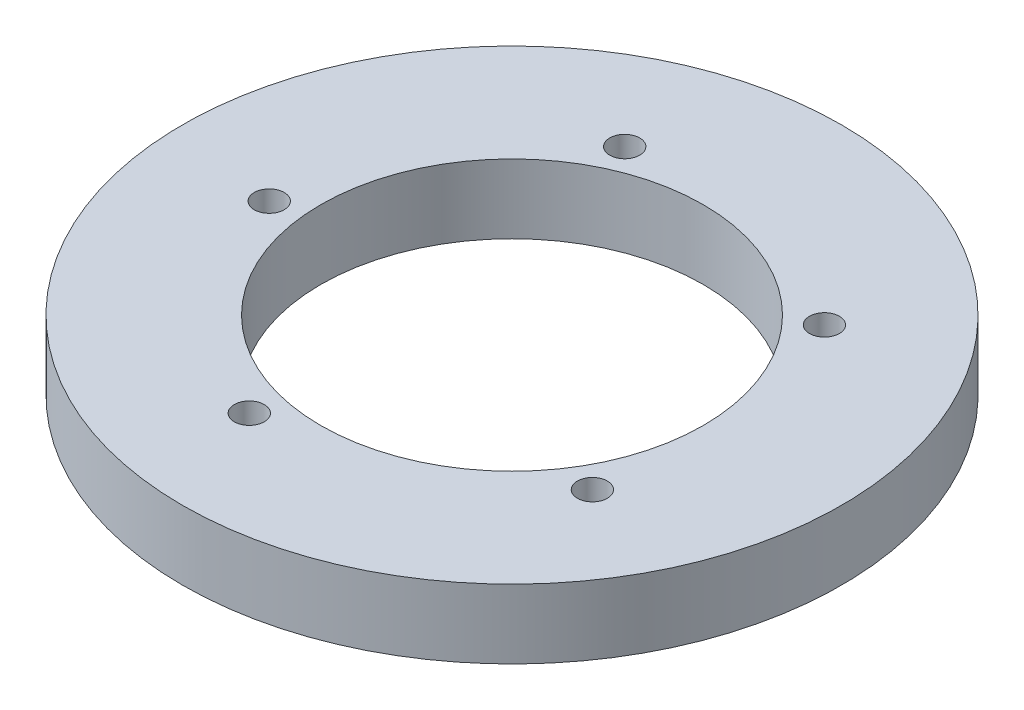
ISO-10303-21;
HEADER;
FILE_DESCRIPTION(('STEP AP214'),'2;1');
FILE_NAME('part.step','',(''),(''),'','','');
FILE_SCHEMA(('AUTOMOTIVE_DESIGN { 1 0 10303 214 1 1 1 1 }'));
ENDSEC;
DATA;
#1=APPLICATION_CONTEXT('core data for automotive mechanical design processes');
#2=APPLICATION_PROTOCOL_DEFINITION('international standard','automotive_design',2000,#1);
#3=PRODUCT_CONTEXT('',#1,'mechanical');
#4=PRODUCT('Part','Part','',(#3));
#5=PRODUCT_RELATED_PRODUCT_CATEGORY('part','',(#4));
#6=PRODUCT_DEFINITION_FORMATION('','',#4);
#7=PRODUCT_DEFINITION_CONTEXT('part definition',#1,'design');
#8=PRODUCT_DEFINITION('design','',#6,#7);
#9=PRODUCT_DEFINITION_SHAPE('','',#8);
#10=(LENGTH_UNIT() NAMED_UNIT(*) SI_UNIT(.MILLI.,.METRE.));
#11=(NAMED_UNIT(*) PLANE_ANGLE_UNIT() SI_UNIT($,.RADIAN.));
#12=(NAMED_UNIT(*) SI_UNIT($,.STERADIAN.) SOLID_ANGLE_UNIT());
#13=UNCERTAINTY_MEASURE_WITH_UNIT(LENGTH_MEASURE(1.E-05),#10,'distance_accuracy_value','');
#14=(GEOMETRIC_REPRESENTATION_CONTEXT(3) GLOBAL_UNCERTAINTY_ASSIGNED_CONTEXT((#13)) GLOBAL_UNIT_ASSIGNED_CONTEXT((#10,
#11,#12)) REPRESENTATION_CONTEXT('',''));
#15=CARTESIAN_POINT('',(0.,0.,0.));
#16=DIRECTION('',(0.,0.,1.));
#17=DIRECTION('',(1.,0.,0.));
#18=AXIS2_PLACEMENT_3D('',#15,#16,#17);
#19=CARTESIAN_POINT('',(-1.33623283332147,15.,-19.9052280990114));
#20=DIRECTION('',(0.,1.,0.));
#21=DIRECTION('',(0.,0.,1.));
#22=AXIS2_PLACEMENT_3D('',#19,#20,#21);
#23=PLANE('',#22);
#24=CARTESIAN_POINT('',(-49.0830279812245,15.,-14.9814538247186));
#25=DIRECTION('',(0.,1.,0.));
#26=DIRECTION('',(0.,0.,1.));
#27=AXIS2_PLACEMENT_3D('',#24,#25,#26);
#28=CIRCLE('',#27,3.25);
#29=CARTESIAN_POINT('',(-49.0830279812245,15.,-11.7314538247186));
#30=VERTEX_POINT('',#29);
#31=EDGE_CURVE('E84',#30,#30,#28,.T.);
#32=ORIENTED_EDGE('',*,*,#31,.F.);
#33=EDGE_LOOP('',(#32));
#34=FACE_BOUND('',#33,.T.);
#35=CARTESIAN_POINT('',(34.3976139642247,15.,-51.9535071955484));
#36=DIRECTION('',(0.,1.,0.));
#37=DIRECTION('',(0.,0.,1.));
#38=AXIS2_PLACEMENT_3D('',#35,#36,#37);
#39=CIRCLE('',#38,3.25);
#40=CARTESIAN_POINT('',(34.3976139642247,15.,-48.7035071955484));
#41=VERTEX_POINT('',#40);
#42=EDGE_CURVE('E68',#41,#41,#39,.T.);
#43=ORIENTED_EDGE('',*,*,#42,.F.);
#44=EDGE_LOOP('',(#43));
#45=FACE_BOUND('',#44,.T.);
#46=CARTESIAN_POINT('',(-1.33623283332147,15.,-19.9052280990114));
#47=DIRECTION('',(0.,1.,0.));
#48=DIRECTION('',(0.,0.,1.));
#49=AXIS2_PLACEMENT_3D('',#46,#47,#48);
#50=CIRCLE('',#49,41.5);
#51=CARTESIAN_POINT('',(-1.33623283332147,15.,21.5947719009886));
#52=VERTEX_POINT('',#51);
#53=EDGE_CURVE('E54',#52,#52,#50,.T.);
#54=ORIENTED_EDGE('',*,*,#53,.F.);
#55=EDGE_LOOP('',(#54));
#56=FACE_BOUND('',#55,.T.);
#57=CARTESIAN_POINT('',(-1.33623283332147,15.,-19.9052280990114));
#58=DIRECTION('',(0.,1.,0.));
#59=DIRECTION('',(0.,0.,1.));
#60=AXIS2_PLACEMENT_3D('',#57,#58,#59);
#61=CIRCLE('',#60,71.5);
#62=CARTESIAN_POINT('',(-1.33623283332147,15.,51.5947719009886));
#63=VERTEX_POINT('',#62);
#64=EDGE_CURVE('E10',#63,#63,#61,.T.);
#65=ORIENTED_EDGE('',*,*,#64,.T.);
#66=EDGE_LOOP('',(#65));
#67=FACE_BOUND('',#66,.T.);
#68=CARTESIAN_POINT('',(40.1858577723177,15.,4.17621686878607));
#69=DIRECTION('',(0.,1.,0.));
#70=DIRECTION('',(0.,0.,1.));
#71=AXIS2_PLACEMENT_3D('',#68,#69,#70);
#72=CIRCLE('',#71,3.24999999999999);
#73=CARTESIAN_POINT('',(40.1858577723177,15.,7.42621686878607));
#74=VERTEX_POINT('',#73);
#75=EDGE_CURVE('E60',#74,#74,#72,.T.);
#76=ORIENTED_EDGE('',*,*,#75,.F.);
#77=EDGE_LOOP('',(#76));
#78=FACE_BOUND('',#77,.T.);
#79=CARTESIAN_POINT('',(-20.7735915692958,15.,-63.7935988294121));
#80=DIRECTION('',(0.,1.,0.));
#81=DIRECTION('',(0.,0.,1.));
#82=AXIS2_PLACEMENT_3D('',#79,#80,#81);
#83=CIRCLE('',#82,3.25);
#84=CARTESIAN_POINT('',(-20.7735915692958,15.,-60.5435988294121));
#85=VERTEX_POINT('',#84);
#86=EDGE_CURVE('E76',#85,#85,#83,.T.);
#87=ORIENTED_EDGE('',*,*,#86,.F.);
#88=EDGE_LOOP('',(#87));
#89=FACE_BOUND('',#88,.T.);
#90=CARTESIAN_POINT('',(-11.4080163526296,15.,27.0262024858338));
#91=DIRECTION('',(0.,1.,0.));
#92=DIRECTION('',(0.,0.,1.));
#93=AXIS2_PLACEMENT_3D('',#90,#91,#92);
#94=CIRCLE('',#93,3.25000000000001);
#95=CARTESIAN_POINT('',(-11.4080163526296,15.,30.2762024858338));
#96=VERTEX_POINT('',#95);
#97=EDGE_CURVE('E92',#96,#96,#94,.T.);
#98=ORIENTED_EDGE('',*,*,#97,.F.);
#99=EDGE_LOOP('',(#98));
#100=FACE_BOUND('',#99,.T.);
#101=ADVANCED_FACE('F41',(#34,#45,#56,#67,#78,#89,#100),#23,.T.);
#102=CARTESIAN_POINT('',(-1.33623283332147,0.,-19.9052280990114));
#103=DIRECTION('',(0.,1.,0.));
#104=DIRECTION('',(0.,0.,1.));
#105=AXIS2_PLACEMENT_3D('',#102,#103,#104);
#106=PLANE('',#105);
#107=CARTESIAN_POINT('',(-1.33623283332147,0.,-19.9052280990114));
#108=DIRECTION('',(0.,1.,0.));
#109=DIRECTION('',(0.,0.,1.));
#110=AXIS2_PLACEMENT_3D('',#107,#108,#109);
#111=CIRCLE('',#110,71.5);
#112=CARTESIAN_POINT('',(-1.33623283332147,0.,51.5947719009886));
#113=VERTEX_POINT('',#112);
#114=EDGE_CURVE('E45',#113,#113,#111,.T.);
#115=ORIENTED_EDGE('',*,*,#114,.F.);
#116=EDGE_LOOP('',(#115));
#117=FACE_BOUND('',#116,.T.);
#118=CARTESIAN_POINT('',(-1.33623283332147,0.,-19.9052280990114));
#119=DIRECTION('',(0.,1.,0.));
#120=DIRECTION('',(0.,0.,1.));
#121=AXIS2_PLACEMENT_3D('',#118,#119,#120);
#122=CIRCLE('',#121,41.5);
#123=CARTESIAN_POINT('',(-1.33623283332147,0.,21.5947719009886));
#124=VERTEX_POINT('',#123);
#125=EDGE_CURVE('E56',#124,#124,#122,.T.);
#126=ORIENTED_EDGE('',*,*,#125,.T.);
#127=EDGE_LOOP('',(#126));
#128=FACE_BOUND('',#127,.T.);
#129=CARTESIAN_POINT('',(40.1858577723177,0.,4.17621686878607));
#130=DIRECTION('',(0.,1.,0.));
#131=DIRECTION('',(0.,0.,1.));
#132=AXIS2_PLACEMENT_3D('',#129,#130,#131);
#133=CIRCLE('',#132,3.24999999999999);
#134=CARTESIAN_POINT('',(40.1858577723177,0.,7.42621686878607));
#135=VERTEX_POINT('',#134);
#136=EDGE_CURVE('E64',#135,#135,#133,.T.);
#137=ORIENTED_EDGE('',*,*,#136,.T.);
#138=EDGE_LOOP('',(#137));
#139=FACE_BOUND('',#138,.T.);
#140=CARTESIAN_POINT('',(34.3976139642247,0.,-51.9535071955484));
#141=DIRECTION('',(0.,1.,0.));
#142=DIRECTION('',(0.,0.,1.));
#143=AXIS2_PLACEMENT_3D('',#140,#141,#142);
#144=CIRCLE('',#143,3.25);
#145=CARTESIAN_POINT('',(34.3976139642247,0.,-48.7035071955484));
#146=VERTEX_POINT('',#145);
#147=EDGE_CURVE('E72',#146,#146,#144,.T.);
#148=ORIENTED_EDGE('',*,*,#147,.T.);
#149=EDGE_LOOP('',(#148));
#150=FACE_BOUND('',#149,.T.);
#151=CARTESIAN_POINT('',(-20.7735915692958,0.,-63.7935988294121));
#152=DIRECTION('',(0.,1.,0.));
#153=DIRECTION('',(0.,0.,1.));
#154=AXIS2_PLACEMENT_3D('',#151,#152,#153);
#155=CIRCLE('',#154,3.25);
#156=CARTESIAN_POINT('',(-20.7735915692958,0.,-60.5435988294121));
#157=VERTEX_POINT('',#156);
#158=EDGE_CURVE('E80',#157,#157,#155,.T.);
#159=ORIENTED_EDGE('',*,*,#158,.T.);
#160=EDGE_LOOP('',(#159));
#161=FACE_BOUND('',#160,.T.);
#162=CARTESIAN_POINT('',(-49.0830279812245,0.,-14.9814538247186));
#163=DIRECTION('',(0.,1.,0.));
#164=DIRECTION('',(0.,0.,1.));
#165=AXIS2_PLACEMENT_3D('',#162,#163,#164);
#166=CIRCLE('',#165,3.25);
#167=CARTESIAN_POINT('',(-49.0830279812245,0.,-11.7314538247186));
#168=VERTEX_POINT('',#167);
#169=EDGE_CURVE('E88',#168,#168,#166,.T.);
#170=ORIENTED_EDGE('',*,*,#169,.T.);
#171=EDGE_LOOP('',(#170));
#172=FACE_BOUND('',#171,.T.);
#173=CARTESIAN_POINT('',(-11.4080163526296,0.,27.0262024858338));
#174=DIRECTION('',(0.,1.,0.));
#175=DIRECTION('',(0.,0.,1.));
#176=AXIS2_PLACEMENT_3D('',#173,#174,#175);
#177=CIRCLE('',#176,3.25000000000001);
#178=CARTESIAN_POINT('',(-11.4080163526296,0.,30.2762024858338));
#179=VERTEX_POINT('',#178);
#180=EDGE_CURVE('E96',#179,#179,#177,.T.);
#181=ORIENTED_EDGE('',*,*,#180,.T.);
#182=EDGE_LOOP('',(#181));
#183=FACE_BOUND('',#182,.T.);
#184=ADVANCED_FACE('F108',(#117,#128,#139,#150,#161,#172,#183),#106,.F.);
#185=CARTESIAN_POINT('',(-1.33623283332147,15.,-19.9052280990114));
#186=DIRECTION('',(0.,-1.,0.));
#187=DIRECTION('',(0.,0.,-1.));
#188=AXIS2_PLACEMENT_3D('',#185,#186,#187);
#189=CYLINDRICAL_SURFACE('',#188,71.5);
#190=ORIENTED_EDGE('',*,*,#64,.F.);
#191=EDGE_LOOP('',(#190));
#192=FACE_BOUND('',#191,.T.);
#193=ORIENTED_EDGE('',*,*,#114,.T.);
#194=EDGE_LOOP('',(#193));
#195=FACE_BOUND('',#194,.T.);
#196=ADVANCED_FACE('F43',(#192,#195),#189,.T.);
#197=CARTESIAN_POINT('',(-1.33623283332147,15.,-19.9052280990114));
#198=DIRECTION('',(0.,-1.,0.));
#199=DIRECTION('',(0.,0.,-1.));
#200=AXIS2_PLACEMENT_3D('',#197,#198,#199);
#201=CYLINDRICAL_SURFACE('',#200,41.5);
#202=ORIENTED_EDGE('',*,*,#53,.T.);
#203=EDGE_LOOP('',(#202));
#204=FACE_BOUND('',#203,.T.);
#205=ORIENTED_EDGE('',*,*,#125,.F.);
#206=EDGE_LOOP('',(#205));
#207=FACE_BOUND('',#206,.T.);
#208=ADVANCED_FACE('F118',(#204,#207),#201,.F.);
#209=CARTESIAN_POINT('',(40.1858577723177,15.,4.17621686878607));
#210=DIRECTION('',(0.,-1.,0.));
#211=DIRECTION('',(0.,0.,-1.));
#212=AXIS2_PLACEMENT_3D('',#209,#210,#211);
#213=CYLINDRICAL_SURFACE('',#212,3.24999999999999);
#214=ORIENTED_EDGE('',*,*,#75,.T.);
#215=EDGE_LOOP('',(#214));
#216=FACE_BOUND('',#215,.T.);
#217=ORIENTED_EDGE('',*,*,#136,.F.);
#218=EDGE_LOOP('',(#217));
#219=FACE_BOUND('',#218,.T.);
#220=ADVANCED_FACE('F121',(#216,#219),#213,.F.);
#221=CARTESIAN_POINT('',(34.3976139642247,15.,-51.9535071955484));
#222=DIRECTION('',(0.,-1.,0.));
#223=DIRECTION('',(0.,0.,-1.));
#224=AXIS2_PLACEMENT_3D('',#221,#222,#223);
#225=CYLINDRICAL_SURFACE('',#224,3.25);
#226=ORIENTED_EDGE('',*,*,#42,.T.);
#227=EDGE_LOOP('',(#226));
#228=FACE_BOUND('',#227,.T.);
#229=ORIENTED_EDGE('',*,*,#147,.F.);
#230=EDGE_LOOP('',(#229));
#231=FACE_BOUND('',#230,.T.);
#232=ADVANCED_FACE('F125',(#228,#231),#225,.F.);
#233=CARTESIAN_POINT('',(-20.7735915692958,15.,-63.7935988294121));
#234=DIRECTION('',(0.,-1.,0.));
#235=DIRECTION('',(0.,0.,-1.));
#236=AXIS2_PLACEMENT_3D('',#233,#234,#235);
#237=CYLINDRICAL_SURFACE('',#236,3.25);
#238=ORIENTED_EDGE('',*,*,#86,.T.);
#239=EDGE_LOOP('',(#238));
#240=FACE_BOUND('',#239,.T.);
#241=ORIENTED_EDGE('',*,*,#158,.F.);
#242=EDGE_LOOP('',(#241));
#243=FACE_BOUND('',#242,.T.);
#244=ADVANCED_FACE('F129',(#240,#243),#237,.F.);
#245=CARTESIAN_POINT('',(-49.0830279812245,15.,-14.9814538247186));
#246=DIRECTION('',(0.,-1.,0.));
#247=DIRECTION('',(0.,0.,-1.));
#248=AXIS2_PLACEMENT_3D('',#245,#246,#247);
#249=CYLINDRICAL_SURFACE('',#248,3.25);
#250=ORIENTED_EDGE('',*,*,#31,.T.);
#251=EDGE_LOOP('',(#250));
#252=FACE_BOUND('',#251,.T.);
#253=ORIENTED_EDGE('',*,*,#169,.F.);
#254=EDGE_LOOP('',(#253));
#255=FACE_BOUND('',#254,.T.);
#256=ADVANCED_FACE('F133',(#252,#255),#249,.F.);
#257=CARTESIAN_POINT('',(-11.4080163526296,15.,27.0262024858338));
#258=DIRECTION('',(0.,-1.,0.));
#259=DIRECTION('',(0.,0.,-1.));
#260=AXIS2_PLACEMENT_3D('',#257,#258,#259);
#261=CYLINDRICAL_SURFACE('',#260,3.25000000000001);
#262=ORIENTED_EDGE('',*,*,#97,.T.);
#263=EDGE_LOOP('',(#262));
#264=FACE_BOUND('',#263,.T.);
#265=ORIENTED_EDGE('',*,*,#180,.F.);
#266=EDGE_LOOP('',(#265));
#267=FACE_BOUND('',#266,.T.);
#268=ADVANCED_FACE('F104',(#264,#267),#261,.F.);
#269=CLOSED_SHELL('',(#101,#184,#196,#208,#220,#232,#244,#256,#268));
#270=MANIFOLD_SOLID_BREP('B2',#269);
#271=ADVANCED_BREP_SHAPE_REPRESENTATION('',(#18,#270),#14);
#272=SHAPE_DEFINITION_REPRESENTATION(#9,#271);
ENDSEC;
END-ISO-10303-21;
